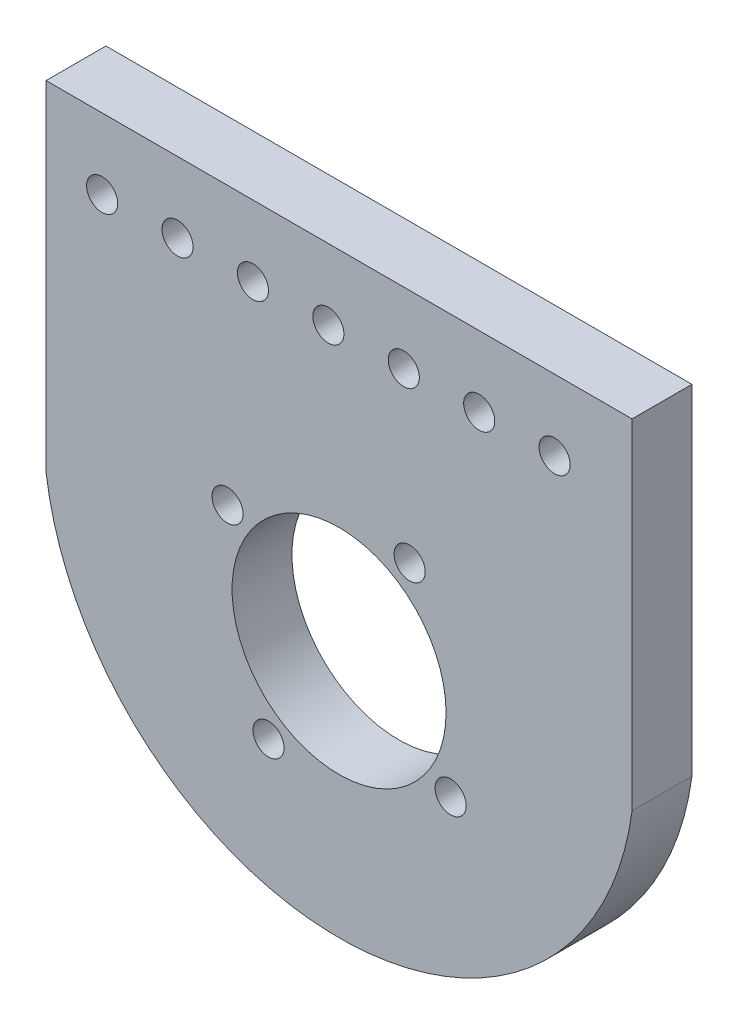
ISO-10303-21;
HEADER;
FILE_DESCRIPTION(('STEP AP214'),'2;1');
FILE_NAME('part.step','',(''),(''),'','','');
FILE_SCHEMA(('AUTOMOTIVE_DESIGN { 1 0 10303 214 1 1 1 1 }'));
ENDSEC;
DATA;
#1=APPLICATION_CONTEXT('core data for automotive mechanical design processes');
#2=APPLICATION_PROTOCOL_DEFINITION('international standard','automotive_design',2000,#1);
#3=PRODUCT_CONTEXT('',#1,'mechanical');
#4=PRODUCT('Part','Part','',(#3));
#5=PRODUCT_RELATED_PRODUCT_CATEGORY('part','',(#4));
#6=PRODUCT_DEFINITION_FORMATION('','',#4);
#7=PRODUCT_DEFINITION_CONTEXT('part definition',#1,'design');
#8=PRODUCT_DEFINITION('design','',#6,#7);
#9=PRODUCT_DEFINITION_SHAPE('','',#8);
#10=(LENGTH_UNIT() NAMED_UNIT(*) SI_UNIT(.MILLI.,.METRE.));
#11=(NAMED_UNIT(*) PLANE_ANGLE_UNIT() SI_UNIT($,.RADIAN.));
#12=(NAMED_UNIT(*) SI_UNIT($,.STERADIAN.) SOLID_ANGLE_UNIT());
#13=UNCERTAINTY_MEASURE_WITH_UNIT(LENGTH_MEASURE(1.E-05),#10,'distance_accuracy_value','');
#14=(GEOMETRIC_REPRESENTATION_CONTEXT(3) GLOBAL_UNCERTAINTY_ASSIGNED_CONTEXT((#13)) GLOBAL_UNIT_ASSIGNED_CONTEXT((#10,
#11,#12)) REPRESENTATION_CONTEXT('',''));
#15=CARTESIAN_POINT('',(0.,0.,0.));
#16=DIRECTION('',(0.,0.,1.));
#17=DIRECTION('',(1.,0.,0.));
#18=AXIS2_PLACEMENT_3D('',#15,#16,#17);
#19=CARTESIAN_POINT('',(0.,5.,6.35));
#20=DIRECTION('',(0.,0.,1.));
#21=DIRECTION('',(1.,0.,0.));
#22=AXIS2_PLACEMENT_3D('',#19,#20,#21);
#23=PLANE('',#22);
#24=CARTESIAN_POINT('',(14.8644194577397,29.3638732013891,6.35));
#25=DIRECTION('',(0.,0.,1.));
#26=DIRECTION('',(1.,0.,0.));
#27=AXIS2_PLACEMENT_3D('',#24,#25,#26);
#28=CIRCLE('',#27,1.65);
#29=CARTESIAN_POINT('',(16.5144194577397,29.3638732013891,6.35));
#30=VERTEX_POINT('',#29);
#31=EDGE_CURVE('E183',#30,#30,#28,.T.);
#32=ORIENTED_EDGE('',*,*,#31,.F.);
#33=EDGE_LOOP('',(#32));
#34=FACE_BOUND('',#33,.T.);
#35=CARTESIAN_POINT('',(-1.13558054226028,29.3638732013889,6.35));
#36=DIRECTION('',(0.,0.,1.));
#37=DIRECTION('',(1.,0.,0.));
#38=AXIS2_PLACEMENT_3D('',#35,#36,#37);
#39=CIRCLE('',#38,1.65);
#40=CARTESIAN_POINT('',(0.514419457739718,29.3638732013889,6.35));
#41=VERTEX_POINT('',#40);
#42=EDGE_CURVE('E171',#41,#41,#39,.T.);
#43=ORIENTED_EDGE('',*,*,#42,.F.);
#44=EDGE_LOOP('',(#43));
#45=FACE_BOUND('',#44,.T.);
#46=CARTESIAN_POINT('',(-17.1355805422603,29.3638732013887,6.35));
#47=DIRECTION('',(0.,0.,1.));
#48=DIRECTION('',(1.,0.,0.));
#49=AXIS2_PLACEMENT_3D('',#46,#47,#48);
#50=CIRCLE('',#49,1.65);
#51=CARTESIAN_POINT('',(-15.4855805422603,29.3638732013887,6.35));
#52=VERTEX_POINT('',#51);
#53=EDGE_CURVE('E159',#52,#52,#50,.T.);
#54=ORIENTED_EDGE('',*,*,#53,.F.);
#55=EDGE_LOOP('',(#54));
#56=FACE_BOUND('',#55,.T.);
#57=CARTESIAN_POINT('',(-7.48351000488464,-11.8320360888049,6.35));
#58=DIRECTION('',(0.,0.,1.));
#59=DIRECTION('',(1.,0.,0.));
#60=AXIS2_PLACEMENT_3D('',#57,#58,#59);
#61=CIRCLE('',#60,1.65);
#62=CARTESIAN_POINT('',(-5.83351000488464,-11.8320360888049,6.35));
#63=VERTEX_POINT('',#62);
#64=EDGE_CURVE('E147',#63,#63,#61,.T.);
#65=ORIENTED_EDGE('',*,*,#64,.F.);
#66=EDGE_LOOP('',(#65));
#67=FACE_BOUND('',#66,.T.);
#68=CARTESIAN_POINT('',(7.48351000488507,11.8320360888055,6.35));
#69=DIRECTION('',(0.,0.,1.));
#70=DIRECTION('',(1.,0.,0.));
#71=AXIS2_PLACEMENT_3D('',#68,#69,#70);
#72=CIRCLE('',#71,1.65);
#73=CARTESIAN_POINT('',(9.13351000488507,11.8320360888055,6.35));
#74=VERTEX_POINT('',#73);
#75=EDGE_CURVE('E135',#74,#74,#72,.T.);
#76=ORIENTED_EDGE('',*,*,#75,.F.);
#77=EDGE_LOOP('',(#76));
#78=FACE_BOUND('',#77,.T.);
#79=CARTESIAN_POINT('',(0.,0.,6.35));
#80=DIRECTION('',(0.,0.,1.));
#81=DIRECTION('',(1.,0.,0.));
#82=AXIS2_PLACEMENT_3D('',#79,#80,#81);
#83=CIRCLE('',#82,11.35);
#84=CARTESIAN_POINT('',(11.35,0.,6.35));
#85=VERTEX_POINT('',#84);
#86=EDGE_CURVE('E107',#85,#85,#83,.T.);
#87=ORIENTED_EDGE('',*,*,#86,.F.);
#88=EDGE_LOOP('',(#87));
#89=FACE_BOUND('',#88,.T.);
#90=DIRECTION('',(0.,1.,0.));
#91=VECTOR('',#90,1.);
#92=CARTESIAN_POINT('',(31.0822011215661,36.8638732013886,6.35));
#93=LINE('',#92,#91);
#94=CARTESIAN_POINT('',(31.0822011215661,0.863873201388699,6.35));
#95=VERTEX_POINT('',#94);
#96=CARTESIAN_POINT('',(31.0822011215661,36.8638732013886,6.35));
#97=VERTEX_POINT('',#96);
#98=EDGE_CURVE('E93',#95,#97,#93,.T.);
#99=ORIENTED_EDGE('',*,*,#98,.T.);
#100=DIRECTION('',(-1.,0.,0.));
#101=VECTOR('',#100,1.);
#102=CARTESIAN_POINT('',(-31.0822011215661,36.8638732013886,6.35));
#103=LINE('',#102,#101);
#104=CARTESIAN_POINT('',(-31.0822011215661,36.8638732013886,6.35));
#105=VERTEX_POINT('',#104);
#106=EDGE_CURVE('E88',#97,#105,#103,.T.);
#107=ORIENTED_EDGE('',*,*,#106,.T.);
#108=DIRECTION('',(0.,-1.,0.));
#109=VECTOR('',#108,1.);
#110=CARTESIAN_POINT('',(-31.0822011215661,36.8638732013886,6.35));
#111=LINE('',#110,#109);
#112=CARTESIAN_POINT('',(-31.0822011215661,0.863873201388555,6.35));
#113=VERTEX_POINT('',#112);
#114=EDGE_CURVE('E91',#105,#113,#111,.T.);
#115=ORIENTED_EDGE('',*,*,#114,.T.);
#116=CARTESIAN_POINT('',(0.,5.,6.35));
#117=DIRECTION('',(0.,0.,1.));
#118=DIRECTION('',(1.,0.,0.));
#119=AXIS2_PLACEMENT_3D('',#116,#117,#118);
#120=CIRCLE('',#119,31.3561919157234);
#121=EDGE_CURVE('E58',#113,#95,#120,.T.);
#122=ORIENTED_EDGE('',*,*,#121,.T.);
#123=EDGE_LOOP('',(#99,#107,#115,#122));
#124=FACE_BOUND('',#123,.T.);
#125=CARTESIAN_POINT('',(-11.832036088805,7.48351000488519,6.35));
#126=DIRECTION('',(0.,0.,1.));
#127=DIRECTION('',(1.,0.,0.));
#128=AXIS2_PLACEMENT_3D('',#125,#126,#127);
#129=CIRCLE('',#128,1.65);
#130=CARTESIAN_POINT('',(-10.182036088805,7.48351000488519,6.35));
#131=VERTEX_POINT('',#130);
#132=EDGE_CURVE('E134',#131,#131,#129,.T.);
#133=ORIENTED_EDGE('',*,*,#132,.F.);
#134=EDGE_LOOP('',(#133));
#135=FACE_BOUND('',#134,.T.);
#136=CARTESIAN_POINT('',(11.8320360888054,-7.48351000488452,6.35));
#137=DIRECTION('',(0.,0.,1.));
#138=DIRECTION('',(1.,0.,0.));
#139=AXIS2_PLACEMENT_3D('',#136,#137,#138);
#140=CIRCLE('',#139,1.65);
#141=CARTESIAN_POINT('',(13.4820360888054,-7.48351000488452,6.35));
#142=VERTEX_POINT('',#141);
#143=EDGE_CURVE('E141',#142,#142,#140,.T.);
#144=ORIENTED_EDGE('',*,*,#143,.F.);
#145=EDGE_LOOP('',(#144));
#146=FACE_BOUND('',#145,.T.);
#147=CARTESIAN_POINT('',(-25.1355805422603,29.3638732013886,6.35));
#148=DIRECTION('',(0.,0.,1.));
#149=DIRECTION('',(1.,0.,0.));
#150=AXIS2_PLACEMENT_3D('',#147,#148,#149);
#151=CIRCLE('',#150,1.65);
#152=CARTESIAN_POINT('',(-23.4855805422603,29.3638732013886,6.35));
#153=VERTEX_POINT('',#152);
#154=EDGE_CURVE('E153',#153,#153,#151,.T.);
#155=ORIENTED_EDGE('',*,*,#154,.F.);
#156=EDGE_LOOP('',(#155));
#157=FACE_BOUND('',#156,.T.);
#158=CARTESIAN_POINT('',(-9.13558054226028,29.3638732013888,6.35));
#159=DIRECTION('',(0.,0.,1.));
#160=DIRECTION('',(1.,0.,0.));
#161=AXIS2_PLACEMENT_3D('',#158,#159,#160);
#162=CIRCLE('',#161,1.65);
#163=CARTESIAN_POINT('',(-7.48558054226028,29.3638732013888,6.35));
#164=VERTEX_POINT('',#163);
#165=EDGE_CURVE('E165',#164,#164,#162,.T.);
#166=ORIENTED_EDGE('',*,*,#165,.F.);
#167=EDGE_LOOP('',(#166));
#168=FACE_BOUND('',#167,.T.);
#169=CARTESIAN_POINT('',(6.86441945773972,29.363873201389,6.35));
#170=DIRECTION('',(0.,0.,1.));
#171=DIRECTION('',(1.,0.,0.));
#172=AXIS2_PLACEMENT_3D('',#169,#170,#171);
#173=CIRCLE('',#172,1.65);
#174=CARTESIAN_POINT('',(8.51441945773972,29.363873201389,6.35));
#175=VERTEX_POINT('',#174);
#176=EDGE_CURVE('E177',#175,#175,#173,.T.);
#177=ORIENTED_EDGE('',*,*,#176,.F.);
#178=EDGE_LOOP('',(#177));
#179=FACE_BOUND('',#178,.T.);
#180=CARTESIAN_POINT('',(22.8644194577397,29.3638732013892,6.35));
#181=DIRECTION('',(0.,0.,1.));
#182=DIRECTION('',(1.,0.,0.));
#183=AXIS2_PLACEMENT_3D('',#180,#181,#182);
#184=CIRCLE('',#183,1.65);
#185=CARTESIAN_POINT('',(24.5144194577397,29.3638732013892,6.35));
#186=VERTEX_POINT('',#185);
#187=EDGE_CURVE('E189',#186,#186,#184,.T.);
#188=ORIENTED_EDGE('',*,*,#187,.F.);
#189=EDGE_LOOP('',(#188));
#190=FACE_BOUND('',#189,.T.);
#191=ADVANCED_FACE('F41',(#34,#45,#56,#67,#78,#89,#124,#135,#146,#157,#168,#179,#190),#23,.T.);
#192=CARTESIAN_POINT('',(0.,5.,0.));
#193=DIRECTION('',(0.,0.,1.));
#194=DIRECTION('',(1.,0.,0.));
#195=AXIS2_PLACEMENT_3D('',#192,#193,#194);
#196=PLANE('',#195);
#197=DIRECTION('',(0.,1.,0.));
#198=VECTOR('',#197,1.);
#199=CARTESIAN_POINT('',(31.0822011215661,36.8638732013886,0.));
#200=LINE('',#199,#198);
#201=CARTESIAN_POINT('',(31.0822011215661,0.863873201388699,0.));
#202=VERTEX_POINT('',#201);
#203=CARTESIAN_POINT('',(31.0822011215661,36.8638732013886,0.));
#204=VERTEX_POINT('',#203);
#205=EDGE_CURVE('E104',#202,#204,#200,.T.);
#206=ORIENTED_EDGE('',*,*,#205,.F.);
#207=CARTESIAN_POINT('',(0.,5.,0.));
#208=DIRECTION('',(0.,0.,1.));
#209=DIRECTION('',(1.,0.,0.));
#210=AXIS2_PLACEMENT_3D('',#207,#208,#209);
#211=CIRCLE('',#210,31.3561919157234);
#212=CARTESIAN_POINT('',(-31.0822011215661,0.863873201388555,0.));
#213=VERTEX_POINT('',#212);
#214=EDGE_CURVE('E81',#213,#202,#211,.T.);
#215=ORIENTED_EDGE('',*,*,#214,.F.);
#216=DIRECTION('',(0.,-1.,0.));
#217=VECTOR('',#216,1.);
#218=CARTESIAN_POINT('',(-31.0822011215661,36.8638732013886,0.));
#219=LINE('',#218,#217);
#220=CARTESIAN_POINT('',(-31.0822011215661,36.8638732013886,0.));
#221=VERTEX_POINT('',#220);
#222=EDGE_CURVE('E75',#221,#213,#219,.T.);
#223=ORIENTED_EDGE('',*,*,#222,.F.);
#224=DIRECTION('',(-1.,0.,0.));
#225=VECTOR('',#224,1.);
#226=CARTESIAN_POINT('',(-31.0822011215661,36.8638732013886,0.));
#227=LINE('',#226,#225);
#228=EDGE_CURVE('E97',#204,#221,#227,.T.);
#229=ORIENTED_EDGE('',*,*,#228,.F.);
#230=EDGE_LOOP('',(#206,#215,#223,#229));
#231=FACE_BOUND('',#230,.T.);
#232=CARTESIAN_POINT('',(0.,0.,0.));
#233=DIRECTION('',(0.,0.,1.));
#234=DIRECTION('',(1.,0.,0.));
#235=AXIS2_PLACEMENT_3D('',#232,#233,#234);
#236=CIRCLE('',#235,11.35);
#237=CARTESIAN_POINT('',(11.35,0.,0.));
#238=VERTEX_POINT('',#237);
#239=EDGE_CURVE('E122',#238,#238,#236,.T.);
#240=ORIENTED_EDGE('',*,*,#239,.T.);
#241=EDGE_LOOP('',(#240));
#242=FACE_BOUND('',#241,.T.);
#243=CARTESIAN_POINT('',(-11.832036088805,7.48351000488519,0.));
#244=DIRECTION('',(0.,0.,1.));
#245=DIRECTION('',(1.,0.,0.));
#246=AXIS2_PLACEMENT_3D('',#243,#244,#245);
#247=CIRCLE('',#246,1.65);
#248=CARTESIAN_POINT('',(-10.182036088805,7.48351000488519,0.));
#249=VERTEX_POINT('',#248);
#250=EDGE_CURVE('E130',#249,#249,#247,.T.);
#251=ORIENTED_EDGE('',*,*,#250,.T.);
#252=EDGE_LOOP('',(#251));
#253=FACE_BOUND('',#252,.T.);
#254=CARTESIAN_POINT('',(7.48351000488507,11.8320360888055,0.));
#255=DIRECTION('',(0.,0.,1.));
#256=DIRECTION('',(1.,0.,0.));
#257=AXIS2_PLACEMENT_3D('',#254,#255,#256);
#258=CIRCLE('',#257,1.65);
#259=CARTESIAN_POINT('',(9.13351000488507,11.8320360888055,0.));
#260=VERTEX_POINT('',#259);
#261=EDGE_CURVE('E138',#260,#260,#258,.T.);
#262=ORIENTED_EDGE('',*,*,#261,.T.);
#263=EDGE_LOOP('',(#262));
#264=FACE_BOUND('',#263,.T.);
#265=CARTESIAN_POINT('',(11.8320360888054,-7.48351000488452,0.));
#266=DIRECTION('',(0.,0.,1.));
#267=DIRECTION('',(1.,0.,0.));
#268=AXIS2_PLACEMENT_3D('',#265,#266,#267);
#269=CIRCLE('',#268,1.65);
#270=CARTESIAN_POINT('',(13.4820360888054,-7.48351000488452,0.));
#271=VERTEX_POINT('',#270);
#272=EDGE_CURVE('E144',#271,#271,#269,.T.);
#273=ORIENTED_EDGE('',*,*,#272,.T.);
#274=EDGE_LOOP('',(#273));
#275=FACE_BOUND('',#274,.T.);
#276=CARTESIAN_POINT('',(-7.48351000488464,-11.8320360888049,0.));
#277=DIRECTION('',(0.,0.,1.));
#278=DIRECTION('',(1.,0.,0.));
#279=AXIS2_PLACEMENT_3D('',#276,#277,#278);
#280=CIRCLE('',#279,1.65);
#281=CARTESIAN_POINT('',(-5.83351000488464,-11.8320360888049,0.));
#282=VERTEX_POINT('',#281);
#283=EDGE_CURVE('E150',#282,#282,#280,.T.);
#284=ORIENTED_EDGE('',*,*,#283,.T.);
#285=EDGE_LOOP('',(#284));
#286=FACE_BOUND('',#285,.T.);
#287=CARTESIAN_POINT('',(-25.1355805422603,29.3638732013886,0.));
#288=DIRECTION('',(0.,0.,1.));
#289=DIRECTION('',(1.,0.,0.));
#290=AXIS2_PLACEMENT_3D('',#287,#288,#289);
#291=CIRCLE('',#290,1.65);
#292=CARTESIAN_POINT('',(-23.4855805422603,29.3638732013886,0.));
#293=VERTEX_POINT('',#292);
#294=EDGE_CURVE('E156',#293,#293,#291,.T.);
#295=ORIENTED_EDGE('',*,*,#294,.T.);
#296=EDGE_LOOP('',(#295));
#297=FACE_BOUND('',#296,.T.);
#298=CARTESIAN_POINT('',(-17.1355805422603,29.3638732013887,0.));
#299=DIRECTION('',(0.,0.,1.));
#300=DIRECTION('',(1.,0.,0.));
#301=AXIS2_PLACEMENT_3D('',#298,#299,#300);
#302=CIRCLE('',#301,1.65);
#303=CARTESIAN_POINT('',(-15.4855805422603,29.3638732013887,0.));
#304=VERTEX_POINT('',#303);
#305=EDGE_CURVE('E162',#304,#304,#302,.T.);
#306=ORIENTED_EDGE('',*,*,#305,.T.);
#307=EDGE_LOOP('',(#306));
#308=FACE_BOUND('',#307,.T.);
#309=CARTESIAN_POINT('',(-9.13558054226028,29.3638732013888,0.));
#310=DIRECTION('',(0.,0.,1.));
#311=DIRECTION('',(1.,0.,0.));
#312=AXIS2_PLACEMENT_3D('',#309,#310,#311);
#313=CIRCLE('',#312,1.65);
#314=CARTESIAN_POINT('',(-7.48558054226028,29.3638732013888,0.));
#315=VERTEX_POINT('',#314);
#316=EDGE_CURVE('E168',#315,#315,#313,.T.);
#317=ORIENTED_EDGE('',*,*,#316,.T.);
#318=EDGE_LOOP('',(#317));
#319=FACE_BOUND('',#318,.T.);
#320=CARTESIAN_POINT('',(-1.13558054226028,29.3638732013889,0.));
#321=DIRECTION('',(0.,0.,1.));
#322=DIRECTION('',(1.,0.,0.));
#323=AXIS2_PLACEMENT_3D('',#320,#321,#322);
#324=CIRCLE('',#323,1.65);
#325=CARTESIAN_POINT('',(0.514419457739718,29.3638732013889,0.));
#326=VERTEX_POINT('',#325);
#327=EDGE_CURVE('E174',#326,#326,#324,.T.);
#328=ORIENTED_EDGE('',*,*,#327,.T.);
#329=EDGE_LOOP('',(#328));
#330=FACE_BOUND('',#329,.T.);
#331=CARTESIAN_POINT('',(6.86441945773972,29.363873201389,0.));
#332=DIRECTION('',(0.,0.,1.));
#333=DIRECTION('',(1.,0.,0.));
#334=AXIS2_PLACEMENT_3D('',#331,#332,#333);
#335=CIRCLE('',#334,1.65);
#336=CARTESIAN_POINT('',(8.51441945773972,29.363873201389,0.));
#337=VERTEX_POINT('',#336);
#338=EDGE_CURVE('E180',#337,#337,#335,.T.);
#339=ORIENTED_EDGE('',*,*,#338,.T.);
#340=EDGE_LOOP('',(#339));
#341=FACE_BOUND('',#340,.T.);
#342=CARTESIAN_POINT('',(14.8644194577397,29.3638732013891,0.));
#343=DIRECTION('',(0.,0.,1.));
#344=DIRECTION('',(1.,0.,0.));
#345=AXIS2_PLACEMENT_3D('',#342,#343,#344);
#346=CIRCLE('',#345,1.65);
#347=CARTESIAN_POINT('',(16.5144194577397,29.3638732013891,0.));
#348=VERTEX_POINT('',#347);
#349=EDGE_CURVE('E186',#348,#348,#346,.T.);
#350=ORIENTED_EDGE('',*,*,#349,.T.);
#351=EDGE_LOOP('',(#350));
#352=FACE_BOUND('',#351,.T.);
#353=CARTESIAN_POINT('',(22.8644194577397,29.3638732013892,0.));
#354=DIRECTION('',(0.,0.,1.));
#355=DIRECTION('',(1.,0.,0.));
#356=AXIS2_PLACEMENT_3D('',#353,#354,#355);
#357=CIRCLE('',#356,1.65);
#358=CARTESIAN_POINT('',(24.5144194577397,29.3638732013892,0.));
#359=VERTEX_POINT('',#358);
#360=EDGE_CURVE('E192',#359,#359,#357,.T.);
#361=ORIENTED_EDGE('',*,*,#360,.T.);
#362=EDGE_LOOP('',(#361));
#363=FACE_BOUND('',#362,.T.);
#364=ADVANCED_FACE('F115',(#231,#242,#253,#264,#275,#286,#297,#308,#319,#330,#341,#352,#363),
#196,.F.);
#365=CARTESIAN_POINT('',(31.0822011215661,36.8638732013886,6.35));
#366=DIRECTION('',(-1.,0.,0.));
#367=DIRECTION('',(0.,-1.,0.));
#368=AXIS2_PLACEMENT_3D('',#365,#366,#367);
#369=PLANE('',#368);
#370=ORIENTED_EDGE('',*,*,#205,.T.);
#371=DIRECTION('',(0.,0.,-1.));
#372=VECTOR('',#371,1.);
#373=CARTESIAN_POINT('',(31.0822011215661,36.8638732013886,6.35));
#374=LINE('',#373,#372);
#375=EDGE_CURVE('E12',#97,#204,#374,.T.);
#376=ORIENTED_EDGE('',*,*,#375,.F.);
#377=ORIENTED_EDGE('',*,*,#98,.F.);
#378=DIRECTION('',(0.,0.,-1.));
#379=VECTOR('',#378,1.);
#380=CARTESIAN_POINT('',(31.0822011215661,0.863873201388699,6.35));
#381=LINE('',#380,#379);
#382=EDGE_CURVE('E101',#95,#202,#381,.T.);
#383=ORIENTED_EDGE('',*,*,#382,.T.);
#384=EDGE_LOOP('',(#370,#376,#377,#383));
#385=FACE_BOUND('',#384,.T.);
#386=ADVANCED_FACE('F43',(#385),#369,.F.);
#387=CARTESIAN_POINT('',(-31.0822011215661,36.8638732013886,6.35));
#388=DIRECTION('',(0.,-1.,0.));
#389=DIRECTION('',(0.,0.,-1.));
#390=AXIS2_PLACEMENT_3D('',#387,#388,#389);
#391=PLANE('',#390);
#392=ORIENTED_EDGE('',*,*,#228,.T.);
#393=DIRECTION('',(0.,0.,-1.));
#394=VECTOR('',#393,1.);
#395=CARTESIAN_POINT('',(-31.0822011215661,36.8638732013886,6.35));
#396=LINE('',#395,#394);
#397=EDGE_CURVE('E50',#105,#221,#396,.T.);
#398=ORIENTED_EDGE('',*,*,#397,.F.);
#399=ORIENTED_EDGE('',*,*,#106,.F.);
#400=ORIENTED_EDGE('',*,*,#375,.T.);
#401=EDGE_LOOP('',(#392,#398,#399,#400));
#402=FACE_BOUND('',#401,.T.);
#403=ADVANCED_FACE('F96',(#402),#391,.F.);
#404=CARTESIAN_POINT('',(-31.0822011215661,36.8638732013886,6.35));
#405=DIRECTION('',(1.,0.,0.));
#406=DIRECTION('',(0.,1.,0.));
#407=AXIS2_PLACEMENT_3D('',#404,#405,#406);
#408=PLANE('',#407);
#409=ORIENTED_EDGE('',*,*,#222,.T.);
#410=DIRECTION('',(0.,0.,-1.));
#411=VECTOR('',#410,1.);
#412=CARTESIAN_POINT('',(-31.0822011215661,0.863873201388555,6.35));
#413=LINE('',#412,#411);
#414=EDGE_CURVE('E98',#113,#213,#413,.T.);
#415=ORIENTED_EDGE('',*,*,#414,.F.);
#416=ORIENTED_EDGE('',*,*,#114,.F.);
#417=ORIENTED_EDGE('',*,*,#397,.T.);
#418=EDGE_LOOP('',(#409,#415,#416,#417));
#419=FACE_BOUND('',#418,.T.);
#420=ADVANCED_FACE('F99',(#419),#408,.F.);
#421=CARTESIAN_POINT('',(0.,5.,6.35));
#422=DIRECTION('',(0.,0.,-1.));
#423=DIRECTION('',(-1.,0.,0.));
#424=AXIS2_PLACEMENT_3D('',#421,#422,#423);
#425=CYLINDRICAL_SURFACE('',#424,31.3561919157234);
#426=ORIENTED_EDGE('',*,*,#214,.T.);
#427=ORIENTED_EDGE('',*,*,#382,.F.);
#428=ORIENTED_EDGE('',*,*,#121,.F.);
#429=ORIENTED_EDGE('',*,*,#414,.T.);
#430=EDGE_LOOP('',(#426,#427,#428,#429));
#431=FACE_BOUND('',#430,.T.);
#432=ADVANCED_FACE('F112',(#431),#425,.T.);
#433=CARTESIAN_POINT('',(0.,0.,6.35));
#434=DIRECTION('',(0.,0.,-1.));
#435=DIRECTION('',(-1.,0.,0.));
#436=AXIS2_PLACEMENT_3D('',#433,#434,#435);
#437=CYLINDRICAL_SURFACE('',#436,11.35);
#438=ORIENTED_EDGE('',*,*,#86,.T.);
#439=EDGE_LOOP('',(#438));
#440=FACE_BOUND('',#439,.T.);
#441=ORIENTED_EDGE('',*,*,#239,.F.);
#442=EDGE_LOOP('',(#441));
#443=FACE_BOUND('',#442,.T.);
#444=ADVANCED_FACE('F211',(#440,#443),#437,.F.);
#445=CARTESIAN_POINT('',(-11.832036088805,7.48351000488519,6.35));
#446=DIRECTION('',(0.,0.,-1.));
#447=DIRECTION('',(-1.,0.,0.));
#448=AXIS2_PLACEMENT_3D('',#445,#446,#447);
#449=CYLINDRICAL_SURFACE('',#448,1.65);
#450=ORIENTED_EDGE('',*,*,#132,.T.);
#451=EDGE_LOOP('',(#450));
#452=FACE_BOUND('',#451,.T.);
#453=ORIENTED_EDGE('',*,*,#250,.F.);
#454=EDGE_LOOP('',(#453));
#455=FACE_BOUND('',#454,.T.);
#456=ADVANCED_FACE('F257',(#452,#455),#449,.F.);
#457=CARTESIAN_POINT('',(7.48351000488507,11.8320360888055,6.35));
#458=DIRECTION('',(0.,0.,-1.));
#459=DIRECTION('',(-1.,0.,0.));
#460=AXIS2_PLACEMENT_3D('',#457,#458,#459);
#461=CYLINDRICAL_SURFACE('',#460,1.65);
#462=ORIENTED_EDGE('',*,*,#75,.T.);
#463=EDGE_LOOP('',(#462));
#464=FACE_BOUND('',#463,.T.);
#465=ORIENTED_EDGE('',*,*,#261,.F.);
#466=EDGE_LOOP('',(#465));
#467=FACE_BOUND('',#466,.T.);
#468=ADVANCED_FACE('F265',(#464,#467),#461,.F.);
#469=CARTESIAN_POINT('',(11.8320360888054,-7.48351000488452,6.35));
#470=DIRECTION('',(0.,0.,-1.));
#471=DIRECTION('',(-1.,0.,0.));
#472=AXIS2_PLACEMENT_3D('',#469,#470,#471);
#473=CYLINDRICAL_SURFACE('',#472,1.65);
#474=ORIENTED_EDGE('',*,*,#143,.T.);
#475=EDGE_LOOP('',(#474));
#476=FACE_BOUND('',#475,.T.);
#477=ORIENTED_EDGE('',*,*,#272,.F.);
#478=EDGE_LOOP('',(#477));
#479=FACE_BOUND('',#478,.T.);
#480=ADVANCED_FACE('F274',(#476,#479),#473,.F.);
#481=CARTESIAN_POINT('',(-7.48351000488464,-11.8320360888049,6.35));
#482=DIRECTION('',(0.,0.,-1.));
#483=DIRECTION('',(-1.,0.,0.));
#484=AXIS2_PLACEMENT_3D('',#481,#482,#483);
#485=CYLINDRICAL_SURFACE('',#484,1.65);
#486=ORIENTED_EDGE('',*,*,#64,.T.);
#487=EDGE_LOOP('',(#486));
#488=FACE_BOUND('',#487,.T.);
#489=ORIENTED_EDGE('',*,*,#283,.F.);
#490=EDGE_LOOP('',(#489));
#491=FACE_BOUND('',#490,.T.);
#492=ADVANCED_FACE('F284',(#488,#491),#485,.F.);
#493=CARTESIAN_POINT('',(-25.1355805422603,29.3638732013886,6.35));
#494=DIRECTION('',(0.,0.,-1.));
#495=DIRECTION('',(-1.,0.,0.));
#496=AXIS2_PLACEMENT_3D('',#493,#494,#495);
#497=CYLINDRICAL_SURFACE('',#496,1.65);
#498=ORIENTED_EDGE('',*,*,#154,.T.);
#499=EDGE_LOOP('',(#498));
#500=FACE_BOUND('',#499,.T.);
#501=ORIENTED_EDGE('',*,*,#294,.F.);
#502=EDGE_LOOP('',(#501));
#503=FACE_BOUND('',#502,.T.);
#504=ADVANCED_FACE('F294',(#500,#503),#497,.F.);
#505=CARTESIAN_POINT('',(-17.1355805422603,29.3638732013887,6.35));
#506=DIRECTION('',(0.,0.,-1.));
#507=DIRECTION('',(-1.,0.,0.));
#508=AXIS2_PLACEMENT_3D('',#505,#506,#507);
#509=CYLINDRICAL_SURFACE('',#508,1.65);
#510=ORIENTED_EDGE('',*,*,#53,.T.);
#511=EDGE_LOOP('',(#510));
#512=FACE_BOUND('',#511,.T.);
#513=ORIENTED_EDGE('',*,*,#305,.F.);
#514=EDGE_LOOP('',(#513));
#515=FACE_BOUND('',#514,.T.);
#516=ADVANCED_FACE('F304',(#512,#515),#509,.F.);
#517=CARTESIAN_POINT('',(-9.13558054226028,29.3638732013888,6.35));
#518=DIRECTION('',(0.,0.,-1.));
#519=DIRECTION('',(-1.,0.,0.));
#520=AXIS2_PLACEMENT_3D('',#517,#518,#519);
#521=CYLINDRICAL_SURFACE('',#520,1.65);
#522=ORIENTED_EDGE('',*,*,#165,.T.);
#523=EDGE_LOOP('',(#522));
#524=FACE_BOUND('',#523,.T.);
#525=ORIENTED_EDGE('',*,*,#316,.F.);
#526=EDGE_LOOP('',(#525));
#527=FACE_BOUND('',#526,.T.);
#528=ADVANCED_FACE('F314',(#524,#527),#521,.F.);
#529=CARTESIAN_POINT('',(-1.13558054226028,29.3638732013889,6.35));
#530=DIRECTION('',(0.,0.,-1.));
#531=DIRECTION('',(-1.,0.,0.));
#532=AXIS2_PLACEMENT_3D('',#529,#530,#531);
#533=CYLINDRICAL_SURFACE('',#532,1.65);
#534=ORIENTED_EDGE('',*,*,#42,.T.);
#535=EDGE_LOOP('',(#534));
#536=FACE_BOUND('',#535,.T.);
#537=ORIENTED_EDGE('',*,*,#327,.F.);
#538=EDGE_LOOP('',(#537));
#539=FACE_BOUND('',#538,.T.);
#540=ADVANCED_FACE('F324',(#536,#539),#533,.F.);
#541=CARTESIAN_POINT('',(6.86441945773972,29.363873201389,6.35));
#542=DIRECTION('',(0.,0.,-1.));
#543=DIRECTION('',(-1.,0.,0.));
#544=AXIS2_PLACEMENT_3D('',#541,#542,#543);
#545=CYLINDRICAL_SURFACE('',#544,1.65);
#546=ORIENTED_EDGE('',*,*,#176,.T.);
#547=EDGE_LOOP('',(#546));
#548=FACE_BOUND('',#547,.T.);
#549=ORIENTED_EDGE('',*,*,#338,.F.);
#550=EDGE_LOOP('',(#549));
#551=FACE_BOUND('',#550,.T.);
#552=ADVANCED_FACE('F334',(#548,#551),#545,.F.);
#553=CARTESIAN_POINT('',(14.8644194577397,29.3638732013891,6.35));
#554=DIRECTION('',(0.,0.,-1.));
#555=DIRECTION('',(-1.,0.,0.));
#556=AXIS2_PLACEMENT_3D('',#553,#554,#555);
#557=CYLINDRICAL_SURFACE('',#556,1.65);
#558=ORIENTED_EDGE('',*,*,#31,.T.);
#559=EDGE_LOOP('',(#558));
#560=FACE_BOUND('',#559,.T.);
#561=ORIENTED_EDGE('',*,*,#349,.F.);
#562=EDGE_LOOP('',(#561));
#563=FACE_BOUND('',#562,.T.);
#564=ADVANCED_FACE('F344',(#560,#563),#557,.F.);
#565=CARTESIAN_POINT('',(22.8644194577397,29.3638732013892,6.35));
#566=DIRECTION('',(0.,0.,-1.));
#567=DIRECTION('',(-1.,0.,0.));
#568=AXIS2_PLACEMENT_3D('',#565,#566,#567);
#569=CYLINDRICAL_SURFACE('',#568,1.65);
#570=ORIENTED_EDGE('',*,*,#187,.T.);
#571=EDGE_LOOP('',(#570));
#572=FACE_BOUND('',#571,.T.);
#573=ORIENTED_EDGE('',*,*,#360,.F.);
#574=EDGE_LOOP('',(#573));
#575=FACE_BOUND('',#574,.T.);
#576=ADVANCED_FACE('F198',(#572,#575),#569,.F.);
#577=CLOSED_SHELL('',(#191,#364,#386,#403,#420,#432,#444,#456,#468,#480,#492,#504,#516,#528,
#540,#552,#564,#576));
#578=MANIFOLD_SOLID_BREP('B2',#577);
#579=ADVANCED_BREP_SHAPE_REPRESENTATION('',(#18,#578),#14);
#580=SHAPE_DEFINITION_REPRESENTATION(#9,#579);
ENDSEC;
END-ISO-10303-21;
